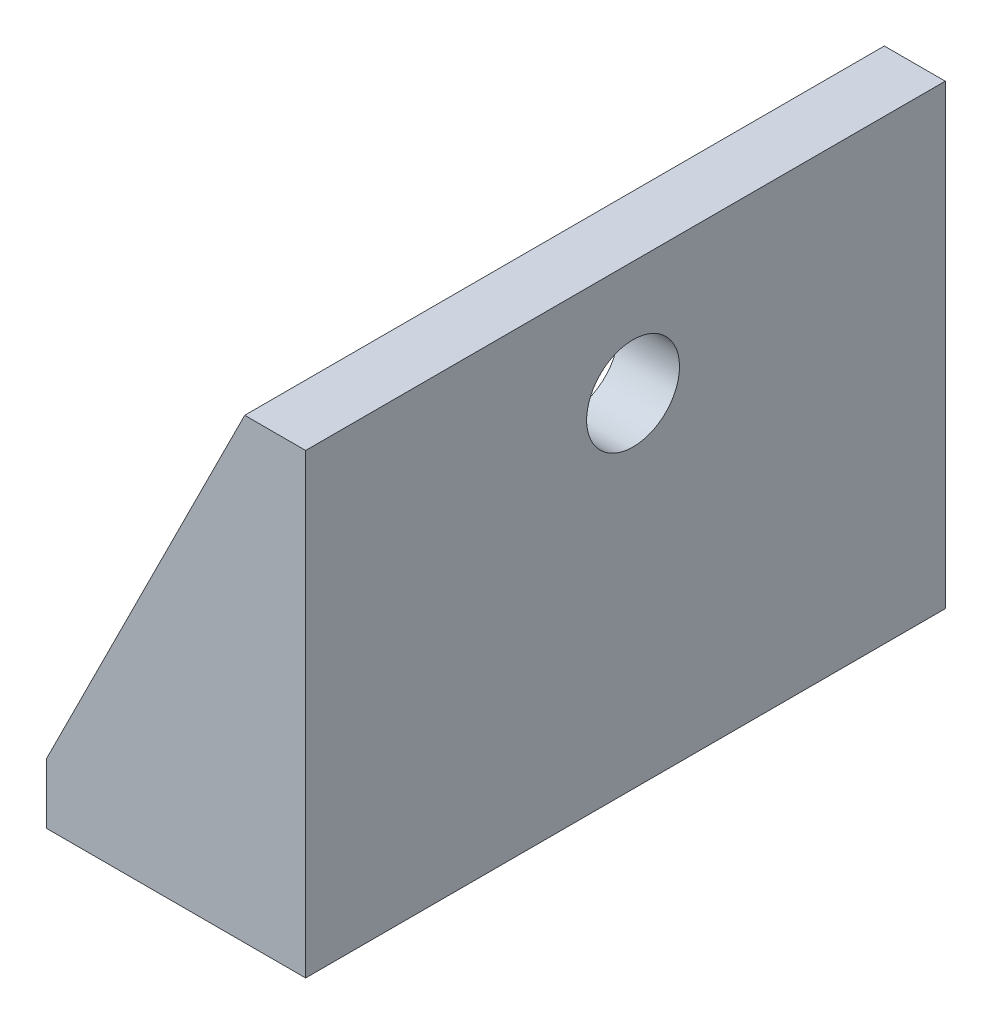
ISO-10303-21;
HEADER;
FILE_DESCRIPTION(('STEP AP214'),'2;1');
FILE_NAME('part.step','',(''),(''),'','','');
FILE_SCHEMA(('AUTOMOTIVE_DESIGN { 1 0 10303 214 1 1 1 1 }'));
ENDSEC;
DATA;
#1=APPLICATION_CONTEXT('core data for automotive mechanical design processes');
#2=APPLICATION_PROTOCOL_DEFINITION('international standard','automotive_design',2000,#1);
#3=PRODUCT_CONTEXT('',#1,'mechanical');
#4=PRODUCT('Part','Part','',(#3));
#5=PRODUCT_RELATED_PRODUCT_CATEGORY('part','',(#4));
#6=PRODUCT_DEFINITION_FORMATION('','',#4);
#7=PRODUCT_DEFINITION_CONTEXT('part definition',#1,'design');
#8=PRODUCT_DEFINITION('design','',#6,#7);
#9=PRODUCT_DEFINITION_SHAPE('','',#8);
#10=(LENGTH_UNIT() NAMED_UNIT(*) SI_UNIT(.MILLI.,.METRE.));
#11=(NAMED_UNIT(*) PLANE_ANGLE_UNIT() SI_UNIT($,.RADIAN.));
#12=(NAMED_UNIT(*) SI_UNIT($,.STERADIAN.) SOLID_ANGLE_UNIT());
#13=UNCERTAINTY_MEASURE_WITH_UNIT(LENGTH_MEASURE(1.E-05),#10,'distance_accuracy_value','');
#14=(GEOMETRIC_REPRESENTATION_CONTEXT(3) GLOBAL_UNCERTAINTY_ASSIGNED_CONTEXT((#13)) GLOBAL_UNIT_ASSIGNED_CONTEXT((#10,
#11,#12)) REPRESENTATION_CONTEXT('',''));
#15=CARTESIAN_POINT('',(0.,0.,0.));
#16=DIRECTION('',(0.,0.,1.));
#17=DIRECTION('',(1.,0.,0.));
#18=AXIS2_PLACEMENT_3D('',#15,#16,#17);
#19=CARTESIAN_POINT('',(0.720000000000004,4.,-14.));
#20=DIRECTION('',(0.,-1.,0.));
#21=DIRECTION('',(0.,0.,-1.));
#22=AXIS2_PLACEMENT_3D('',#19,#20,#21);
#23=CYLINDRICAL_SURFACE('',#22,1.75);
#24=CARTESIAN_POINT('',(0.720000000000004,0.,-14.));
#25=DIRECTION('',(0.,1.,0.));
#26=DIRECTION('',(0.,0.,1.));
#27=AXIS2_PLACEMENT_3D('',#24,#25,#26);
#28=CIRCLE('',#27,1.75);
#29=CARTESIAN_POINT('',(0.720000000000004,0.,-12.25));
#30=VERTEX_POINT('',#29);
#31=EDGE_CURVE('E412',#30,#30,#28,.T.);
#32=ORIENTED_EDGE('',*,*,#31,.F.);
#33=EDGE_LOOP('',(#32));
#34=FACE_BOUND('',#33,.T.);
#35=CARTESIAN_POINT('',(0.720000000000004,1.5,-14.));
#36=DIRECTION('',(0.,1.,0.));
#37=DIRECTION('',(0.,0.,1.));
#38=AXIS2_PLACEMENT_3D('',#35,#36,#37);
#39=CIRCLE('',#38,1.75);
#40=CARTESIAN_POINT('',(0.720000000000004,1.5,-12.25));
#41=VERTEX_POINT('',#40);
#42=EDGE_CURVE('E49',#41,#41,#39,.T.);
#43=ORIENTED_EDGE('',*,*,#42,.T.);
#44=EDGE_LOOP('',(#43));
#45=FACE_BOUND('',#44,.T.);
#46=ADVANCED_FACE('F45',(#34,#45),#23,.F.);
#47=CARTESIAN_POINT('',(0.720000000000035,4.,14.));
#48=DIRECTION('',(0.,-1.,0.));
#49=DIRECTION('',(0.,0.,-1.));
#50=AXIS2_PLACEMENT_3D('',#47,#48,#49);
#51=CYLINDRICAL_SURFACE('',#50,1.75);
#52=CARTESIAN_POINT('',(0.720000000000035,0.,14.));
#53=DIRECTION('',(0.,1.,0.));
#54=DIRECTION('',(0.,0.,1.));
#55=AXIS2_PLACEMENT_3D('',#52,#53,#54);
#56=CIRCLE('',#55,1.75);
#57=CARTESIAN_POINT('',(0.720000000000035,0.,15.75));
#58=VERTEX_POINT('',#57);
#59=EDGE_CURVE('E399',#58,#58,#56,.T.);
#60=ORIENTED_EDGE('',*,*,#59,.F.);
#61=EDGE_LOOP('',(#60));
#62=FACE_BOUND('',#61,.T.);
#63=CARTESIAN_POINT('',(0.720000000000035,1.5,14.));
#64=DIRECTION('',(0.,1.,0.));
#65=DIRECTION('',(0.,0.,1.));
#66=AXIS2_PLACEMENT_3D('',#63,#64,#65);
#67=CIRCLE('',#66,1.75);
#68=CARTESIAN_POINT('',(0.720000000000035,1.5,15.75));
#69=VERTEX_POINT('',#68);
#70=EDGE_CURVE('E277',#69,#69,#67,.T.);
#71=ORIENTED_EDGE('',*,*,#70,.T.);
#72=EDGE_LOOP('',(#71));
#73=FACE_BOUND('',#72,.T.);
#74=ADVANCED_FACE('F47',(#62,#73),#51,.F.);
#75=CARTESIAN_POINT('',(0.,4.,0.));
#76=DIRECTION('',(0.,1.,0.));
#77=DIRECTION('',(0.,0.,1.));
#78=AXIS2_PLACEMENT_3D('',#75,#76,#77);
#79=PLANE('',#78);
#80=DIRECTION('',(-0.5,0.,0.866025403784439));
#81=VECTOR('',#80,1.);
#82=CARTESIAN_POINT('',(-0.9254482671904,4.,11.15));
#83=LINE('',#82,#81);
#84=CARTESIAN_POINT('',(-0.9254482671904,4.,11.15));
#85=VERTEX_POINT('',#84);
#86=CARTESIAN_POINT('',(-2.57089653438083,4.,14.));
#87=VERTEX_POINT('',#86);
#88=EDGE_CURVE('E63',#85,#87,#83,.T.);
#89=ORIENTED_EDGE('',*,*,#88,.F.);
#90=DIRECTION('',(-1.,0.,0.));
#91=VECTOR('',#90,1.);
#92=CARTESIAN_POINT('',(2.36544826719046,4.,11.15));
#93=LINE('',#92,#91);
#94=CARTESIAN_POINT('',(2.36544826719046,4.,11.15));
#95=VERTEX_POINT('',#94);
#96=EDGE_CURVE('E232',#95,#85,#93,.T.);
#97=ORIENTED_EDGE('',*,*,#96,.F.);
#98=DIRECTION('',(-0.5,0.,-0.866025403784439));
#99=VECTOR('',#98,1.);
#100=CARTESIAN_POINT('',(4.0108965343809,4.,14.));
#101=LINE('',#100,#99);
#102=CARTESIAN_POINT('',(4.0108965343809,4.,14.));
#103=VERTEX_POINT('',#102);
#104=EDGE_CURVE('E267',#103,#95,#101,.T.);
#105=ORIENTED_EDGE('',*,*,#104,.F.);
#106=DIRECTION('',(0.5,0.,-0.866025403784439));
#107=VECTOR('',#106,1.);
#108=CARTESIAN_POINT('',(2.36544826719047,4.,16.85));
#109=LINE('',#108,#107);
#110=CARTESIAN_POINT('',(2.36544826719047,4.,16.85));
#111=VERTEX_POINT('',#110);
#112=EDGE_CURVE('E263',#111,#103,#109,.T.);
#113=ORIENTED_EDGE('',*,*,#112,.F.);
#114=DIRECTION('',(1.,0.,0.));
#115=VECTOR('',#114,1.);
#116=CARTESIAN_POINT('',(-0.925448267190399,4.,16.85));
#117=LINE('',#116,#115);
#118=CARTESIAN_POINT('',(-0.925448267190399,4.,16.85));
#119=VERTEX_POINT('',#118);
#120=EDGE_CURVE('E259',#119,#111,#117,.T.);
#121=ORIENTED_EDGE('',*,*,#120,.F.);
#122=DIRECTION('',(0.5,0.,0.866025403784439));
#123=VECTOR('',#122,1.);
#124=CARTESIAN_POINT('',(-2.57089653438083,4.,14.));
#125=LINE('',#124,#123);
#126=EDGE_CURVE('E255',#87,#119,#125,.T.);
#127=ORIENTED_EDGE('',*,*,#126,.F.);
#128=EDGE_LOOP('',(#89,#97,#105,#113,#121,#127));
#129=FACE_BOUND('',#128,.T.);
#130=DIRECTION('',(-0.5,0.,0.866025403784439));
#131=VECTOR('',#130,1.);
#132=CARTESIAN_POINT('',(-0.92544826719043,4.,-16.85));
#133=LINE('',#132,#131);
#134=CARTESIAN_POINT('',(-0.92544826719043,4.,-16.85));
#135=VERTEX_POINT('',#134);
#136=CARTESIAN_POINT('',(-2.57089653438086,4.,-14.));
#137=VERTEX_POINT('',#136);
#138=EDGE_CURVE('E71',#135,#137,#133,.T.);
#139=ORIENTED_EDGE('',*,*,#138,.F.);
#140=DIRECTION('',(-1.,0.,0.));
#141=VECTOR('',#140,1.);
#142=CARTESIAN_POINT('',(2.36544826719043,4.,-16.85));
#143=LINE('',#142,#141);
#144=CARTESIAN_POINT('',(2.36544826719043,4.,-16.85));
#145=VERTEX_POINT('',#144);
#146=EDGE_CURVE('E310',#145,#135,#143,.T.);
#147=ORIENTED_EDGE('',*,*,#146,.F.);
#148=DIRECTION('',(-0.5,0.,-0.866025403784439));
#149=VECTOR('',#148,1.);
#150=CARTESIAN_POINT('',(4.01089653438087,4.,-14.));
#151=LINE('',#150,#149);
#152=CARTESIAN_POINT('',(4.01089653438087,4.,-14.));
#153=VERTEX_POINT('',#152);
#154=EDGE_CURVE('E314',#153,#145,#151,.T.);
#155=ORIENTED_EDGE('',*,*,#154,.F.);
#156=DIRECTION('',(0.5,0.,-0.866025403784439));
#157=VECTOR('',#156,1.);
#158=CARTESIAN_POINT('',(2.36544826719044,4.,-11.15));
#159=LINE('',#158,#157);
#160=CARTESIAN_POINT('',(2.36544826719044,4.,-11.15));
#161=VERTEX_POINT('',#160);
#162=EDGE_CURVE('E319',#161,#153,#159,.T.);
#163=ORIENTED_EDGE('',*,*,#162,.F.);
#164=DIRECTION('',(1.,0.,0.));
#165=VECTOR('',#164,1.);
#166=CARTESIAN_POINT('',(-0.925448267190429,4.,-11.15));
#167=LINE('',#166,#165);
#168=CARTESIAN_POINT('',(-0.925448267190429,4.,-11.15));
#169=VERTEX_POINT('',#168);
#170=EDGE_CURVE('E323',#169,#161,#167,.T.);
#171=ORIENTED_EDGE('',*,*,#170,.F.);
#172=DIRECTION('',(0.5,0.,0.866025403784439));
#173=VECTOR('',#172,1.);
#174=CARTESIAN_POINT('',(-2.57089653438086,4.,-14.));
#175=LINE('',#174,#173);
#176=EDGE_CURVE('E327',#137,#169,#175,.T.);
#177=ORIENTED_EDGE('',*,*,#176,.F.);
#178=EDGE_LOOP('',(#139,#147,#155,#163,#171,#177));
#179=FACE_BOUND('',#178,.T.);
#180=DIRECTION('',(0.,0.,-1.));
#181=VECTOR('',#180,1.);
#182=CARTESIAN_POINT('',(5.5,4.,0.));
#183=LINE('',#182,#181);
#184=CARTESIAN_POINT('',(5.5,4.,19.));
#185=VERTEX_POINT('',#184);
#186=CARTESIAN_POINT('',(5.5,4.,-19.));
#187=VERTEX_POINT('',#186);
#188=EDGE_CURVE('E405',#185,#187,#183,.T.);
#189=ORIENTED_EDGE('',*,*,#188,.T.);
#190=DIRECTION('',(-1.,0.,0.));
#191=VECTOR('',#190,1.);
#192=CARTESIAN_POINT('',(0.,4.,-19.));
#193=LINE('',#192,#191);
#194=CARTESIAN_POINT('',(-7.5,4.,-19.));
#195=VERTEX_POINT('',#194);
#196=EDGE_CURVE('E366',#187,#195,#193,.T.);
#197=ORIENTED_EDGE('',*,*,#196,.T.);
#198=DIRECTION('',(0.,0.,1.));
#199=VECTOR('',#198,1.);
#200=CARTESIAN_POINT('',(-7.5,4.,0.));
#201=LINE('',#200,#199);
#202=CARTESIAN_POINT('',(-7.5,4.,19.));
#203=VERTEX_POINT('',#202);
#204=EDGE_CURVE('E195',#195,#203,#201,.T.);
#205=ORIENTED_EDGE('',*,*,#204,.T.);
#206=DIRECTION('',(1.,0.,0.));
#207=VECTOR('',#206,1.);
#208=CARTESIAN_POINT('',(0.,4.,19.));
#209=LINE('',#208,#207);
#210=EDGE_CURVE('E381',#203,#185,#209,.T.);
#211=ORIENTED_EDGE('',*,*,#210,.T.);
#212=EDGE_LOOP('',(#189,#197,#205,#211));
#213=FACE_BOUND('',#212,.T.);
#214=ADVANCED_FACE('F457',(#129,#179,#213),#79,.T.);
#215=CARTESIAN_POINT('',(5.5,30.,0.));
#216=DIRECTION('',(-1.,0.,0.));
#217=DIRECTION('',(0.,0.,1.));
#218=AXIS2_PLACEMENT_3D('',#215,#216,#217);
#219=PLANE('',#218);
#220=CARTESIAN_POINT('',(5.50000000000001,22.5,-0.500000000000001));
#221=DIRECTION('',(-1.,0.,0.));
#222=DIRECTION('',(0.,0.,1.));
#223=AXIS2_PLACEMENT_3D('',#220,#221,#222);
#224=CIRCLE('',#223,3.05);
#225=CARTESIAN_POINT('',(5.50000000000001,22.5,2.55));
#226=VERTEX_POINT('',#225);
#227=EDGE_CURVE('E214',#226,#226,#224,.T.);
#228=ORIENTED_EDGE('',*,*,#227,.F.);
#229=EDGE_LOOP('',(#228));
#230=FACE_BOUND('',#229,.T.);
#231=DIRECTION('',(0.,0.,-1.));
#232=VECTOR('',#231,1.);
#233=CARTESIAN_POINT('',(5.5,30.,0.));
#234=LINE('',#233,#232);
#235=CARTESIAN_POINT('',(5.50000000000001,30.,19.));
#236=VERTEX_POINT('',#235);
#237=CARTESIAN_POINT('',(5.5,30.,-19.));
#238=VERTEX_POINT('',#237);
#239=EDGE_CURVE('E400',#236,#238,#234,.T.);
#240=ORIENTED_EDGE('',*,*,#239,.T.);
#241=DIRECTION('',(0.,-1.,0.));
#242=VECTOR('',#241,1.);
#243=CARTESIAN_POINT('',(5.5,30.,-19.));
#244=LINE('',#243,#242);
#245=EDGE_CURVE('E359',#238,#187,#244,.T.);
#246=ORIENTED_EDGE('',*,*,#245,.T.);
#247=ORIENTED_EDGE('',*,*,#188,.F.);
#248=DIRECTION('',(0.,1.,0.));
#249=VECTOR('',#248,1.);
#250=CARTESIAN_POINT('',(5.5,30.,19.));
#251=LINE('',#250,#249);
#252=EDGE_CURVE('E374',#185,#236,#251,.T.);
#253=ORIENTED_EDGE('',*,*,#252,.T.);
#254=EDGE_LOOP('',(#240,#246,#247,#253));
#255=FACE_BOUND('',#254,.T.);
#256=ADVANCED_FACE('F460',(#230,#255),#219,.T.);
#257=CARTESIAN_POINT('',(0.,4.,-21.));
#258=DIRECTION('',(0.,0.,1.));
#259=DIRECTION('',(1.,0.,0.));
#260=AXIS2_PLACEMENT_3D('',#257,#258,#259);
#261=PLANE('',#260);
#262=DIRECTION('',(0.447213595499958,0.894427190999916,0.));
#263=VECTOR('',#262,1.);
#264=CARTESIAN_POINT('',(-7.5,4.,-21.));
#265=LINE('',#264,#263);
#266=CARTESIAN_POINT('',(-7.5,4.,-21.));
#267=VERTEX_POINT('',#266);
#268=CARTESIAN_POINT('',(5.50000000000001,30.,-21.));
#269=VERTEX_POINT('',#268);
#270=EDGE_CURVE('E355',#267,#269,#265,.T.);
#271=ORIENTED_EDGE('',*,*,#270,.T.);
#272=DIRECTION('',(-1.,0.,0.));
#273=VECTOR('',#272,1.);
#274=CARTESIAN_POINT('',(0.,30.,-21.));
#275=LINE('',#274,#273);
#276=CARTESIAN_POINT('',(9.5,30.,-21.));
#277=VERTEX_POINT('',#276);
#278=EDGE_CURVE('E391',#277,#269,#275,.T.);
#279=ORIENTED_EDGE('',*,*,#278,.F.);
#280=DIRECTION('',(0.,1.,0.));
#281=VECTOR('',#280,1.);
#282=CARTESIAN_POINT('',(9.5,0.,-21.));
#283=LINE('',#282,#281);
#284=CARTESIAN_POINT('',(9.5,0.,-21.));
#285=VERTEX_POINT('',#284);
#286=EDGE_CURVE('E207',#285,#277,#283,.T.);
#287=ORIENTED_EDGE('',*,*,#286,.F.);
#288=DIRECTION('',(-1.,0.,0.));
#289=VECTOR('',#288,1.);
#290=CARTESIAN_POINT('',(0.,0.,-21.));
#291=LINE('',#290,#289);
#292=CARTESIAN_POINT('',(-7.5,0.,-21.));
#293=VERTEX_POINT('',#292);
#294=EDGE_CURVE('E202',#285,#293,#291,.T.);
#295=ORIENTED_EDGE('',*,*,#294,.T.);
#296=DIRECTION('',(0.,-1.,0.));
#297=VECTOR('',#296,1.);
#298=CARTESIAN_POINT('',(-7.5,4.,-21.));
#299=LINE('',#298,#297);
#300=EDGE_CURVE('E11',#267,#293,#299,.T.);
#301=ORIENTED_EDGE('',*,*,#300,.F.);
#302=EDGE_LOOP('',(#271,#279,#287,#295,#301));
#303=FACE_BOUND('',#302,.T.);
#304=ADVANCED_FACE('F482',(#303),#261,.F.);
#305=CARTESIAN_POINT('',(-7.5,4.,0.));
#306=DIRECTION('',(1.,0.,0.));
#307=DIRECTION('',(0.,0.,-1.));
#308=AXIS2_PLACEMENT_3D('',#305,#306,#307);
#309=PLANE('',#308);
#310=DIRECTION('',(0.,0.,1.));
#311=VECTOR('',#310,1.);
#312=CARTESIAN_POINT('',(-7.5,0.,0.));
#313=LINE('',#312,#311);
#314=CARTESIAN_POINT('',(-7.5,0.,21.));
#315=VERTEX_POINT('',#314);
#316=EDGE_CURVE('E196',#293,#315,#313,.T.);
#317=ORIENTED_EDGE('',*,*,#316,.T.);
#318=DIRECTION('',(0.,-1.,0.));
#319=VECTOR('',#318,1.);
#320=CARTESIAN_POINT('',(-7.5,4.,21.));
#321=LINE('',#320,#319);
#322=CARTESIAN_POINT('',(-7.5,4.,21.));
#323=VERTEX_POINT('',#322);
#324=EDGE_CURVE('E55',#323,#315,#321,.T.);
#325=ORIENTED_EDGE('',*,*,#324,.F.);
#326=DIRECTION('',(0.,0.,-1.));
#327=VECTOR('',#326,1.);
#328=CARTESIAN_POINT('',(-7.5,4.,0.));
#329=LINE('',#328,#327);
#330=EDGE_CURVE('E384',#203,#323,#329,.F.);
#331=ORIENTED_EDGE('',*,*,#330,.F.);
#332=ORIENTED_EDGE('',*,*,#204,.F.);
#333=EDGE_CURVE('E401',#267,#195,#201,.T.);
#334=ORIENTED_EDGE('',*,*,#333,.F.);
#335=ORIENTED_EDGE('',*,*,#300,.T.);
#336=EDGE_LOOP('',(#317,#325,#331,#332,#334,#335));
#337=FACE_BOUND('',#336,.T.);
#338=ADVANCED_FACE('F479',(#337),#309,.F.);
#339=CARTESIAN_POINT('',(0.,4.,21.));
#340=DIRECTION('',(0.,0.,1.));
#341=DIRECTION('',(1.,0.,0.));
#342=AXIS2_PLACEMENT_3D('',#339,#340,#341);
#343=PLANE('',#342);
#344=ORIENTED_EDGE('',*,*,#324,.T.);
#345=DIRECTION('',(-1.,0.,0.));
#346=VECTOR('',#345,1.);
#347=CARTESIAN_POINT('',(0.,0.,21.));
#348=LINE('',#347,#346);
#349=CARTESIAN_POINT('',(9.50000000000001,0.,21.));
#350=VERTEX_POINT('',#349);
#351=EDGE_CURVE('E185',#350,#315,#348,.T.);
#352=ORIENTED_EDGE('',*,*,#351,.F.);
#353=DIRECTION('',(0.,-1.,0.));
#354=VECTOR('',#353,1.);
#355=CARTESIAN_POINT('',(9.50000000000001,0.,21.));
#356=LINE('',#355,#354);
#357=CARTESIAN_POINT('',(9.50000000000001,30.,21.));
#358=VERTEX_POINT('',#357);
#359=EDGE_CURVE('E189',#358,#350,#356,.T.);
#360=ORIENTED_EDGE('',*,*,#359,.F.);
#361=DIRECTION('',(-1.,0.,0.));
#362=VECTOR('',#361,1.);
#363=CARTESIAN_POINT('',(0.,30.,21.));
#364=LINE('',#363,#362);
#365=CARTESIAN_POINT('',(5.5,30.,21.));
#366=VERTEX_POINT('',#365);
#367=EDGE_CURVE('E388',#358,#366,#364,.T.);
#368=ORIENTED_EDGE('',*,*,#367,.T.);
#369=DIRECTION('',(0.447213595499958,0.894427190999916,0.));
#370=VECTOR('',#369,1.);
#371=CARTESIAN_POINT('',(-7.5,4.,21.));
#372=LINE('',#371,#370);
#373=EDGE_CURVE('E370',#323,#366,#372,.T.);
#374=ORIENTED_EDGE('',*,*,#373,.F.);
#375=EDGE_LOOP('',(#344,#352,#360,#368,#374));
#376=FACE_BOUND('',#375,.T.);
#377=ADVANCED_FACE('F187',(#376),#343,.T.);
#378=CARTESIAN_POINT('',(0.,0.,0.));
#379=DIRECTION('',(0.,1.,0.));
#380=DIRECTION('',(0.,0.,1.));
#381=AXIS2_PLACEMENT_3D('',#378,#379,#380);
#382=PLANE('',#381);
#383=ORIENTED_EDGE('',*,*,#316,.F.);
#384=ORIENTED_EDGE('',*,*,#294,.F.);
#385=DIRECTION('',(0.,0.,-1.));
#386=VECTOR('',#385,1.);
#387=CARTESIAN_POINT('',(9.50000000000001,0.,21.));
#388=LINE('',#387,#386);
#389=EDGE_CURVE('E199',#350,#285,#388,.T.);
#390=ORIENTED_EDGE('',*,*,#389,.F.);
#391=ORIENTED_EDGE('',*,*,#351,.T.);
#392=EDGE_LOOP('',(#383,#384,#390,#391));
#393=FACE_BOUND('',#392,.T.);
#394=ORIENTED_EDGE('',*,*,#59,.T.);
#395=EDGE_LOOP('',(#394));
#396=FACE_BOUND('',#395,.T.);
#397=ORIENTED_EDGE('',*,*,#31,.T.);
#398=EDGE_LOOP('',(#397));
#399=FACE_BOUND('',#398,.T.);
#400=ADVANCED_FACE('F200',(#393,#396,#399),#382,.F.);
#401=CARTESIAN_POINT('',(0.,30.,0.));
#402=DIRECTION('',(0.,1.,0.));
#403=DIRECTION('',(0.,0.,1.));
#404=AXIS2_PLACEMENT_3D('',#401,#402,#403);
#405=PLANE('',#404);
#406=EDGE_CURVE('E394',#238,#269,#234,.T.);
#407=ORIENTED_EDGE('',*,*,#406,.F.);
#408=ORIENTED_EDGE('',*,*,#239,.F.);
#409=EDGE_CURVE('E395',#366,#236,#234,.T.);
#410=ORIENTED_EDGE('',*,*,#409,.F.);
#411=ORIENTED_EDGE('',*,*,#367,.F.);
#412=DIRECTION('',(0.,0.,1.));
#413=VECTOR('',#412,1.);
#414=CARTESIAN_POINT('',(9.50000000000001,30.,21.));
#415=LINE('',#414,#413);
#416=EDGE_CURVE('E212',#277,#358,#415,.T.);
#417=ORIENTED_EDGE('',*,*,#416,.F.);
#418=ORIENTED_EDGE('',*,*,#278,.T.);
#419=EDGE_LOOP('',(#407,#408,#410,#411,#417,#418));
#420=FACE_BOUND('',#419,.T.);
#421=ADVANCED_FACE('F488',(#420),#405,.T.);
#422=CARTESIAN_POINT('',(-7.5,4.,21.));
#423=DIRECTION('',(0.894427190999916,-0.447213595499958,0.));
#424=DIRECTION('',(0.447213595499958,0.894427190999916,0.));
#425=AXIS2_PLACEMENT_3D('',#422,#423,#424);
#426=PLANE('',#425);
#427=DIRECTION('',(0.447213595499958,0.894427190999916,0.));
#428=VECTOR('',#427,1.);
#429=CARTESIAN_POINT('',(-7.5,4.,19.));
#430=LINE('',#429,#428);
#431=EDGE_CURVE('E369',#203,#236,#430,.T.);
#432=ORIENTED_EDGE('',*,*,#431,.F.);
#433=ORIENTED_EDGE('',*,*,#330,.T.);
#434=ORIENTED_EDGE('',*,*,#373,.T.);
#435=ORIENTED_EDGE('',*,*,#409,.T.);
#436=EDGE_LOOP('',(#432,#433,#434,#435));
#437=FACE_BOUND('',#436,.T.);
#438=ADVANCED_FACE('F485',(#437),#426,.F.);
#439=CARTESIAN_POINT('',(0.,15.,19.));
#440=DIRECTION('',(0.,0.,1.));
#441=DIRECTION('',(1.,0.,0.));
#442=AXIS2_PLACEMENT_3D('',#439,#440,#441);
#443=PLANE('',#442);
#444=ORIENTED_EDGE('',*,*,#210,.F.);
#445=ORIENTED_EDGE('',*,*,#431,.T.);
#446=ORIENTED_EDGE('',*,*,#252,.F.);
#447=EDGE_LOOP('',(#444,#445,#446));
#448=FACE_BOUND('',#447,.T.);
#449=ADVANCED_FACE('F491',(#448),#443,.F.);
#450=CARTESIAN_POINT('',(-7.5,4.,-21.));
#451=DIRECTION('',(-0.894427190999916,0.447213595499958,0.));
#452=DIRECTION('',(0.447213595499958,0.894427190999916,0.));
#453=AXIS2_PLACEMENT_3D('',#450,#451,#452);
#454=PLANE('',#453);
#455=ORIENTED_EDGE('',*,*,#270,.F.);
#456=ORIENTED_EDGE('',*,*,#333,.T.);
#457=DIRECTION('',(0.447213595499958,0.894427190999916,0.));
#458=VECTOR('',#457,1.);
#459=CARTESIAN_POINT('',(-7.5,4.,-19.));
#460=LINE('',#459,#458);
#461=EDGE_CURVE('E360',#195,#238,#460,.T.);
#462=ORIENTED_EDGE('',*,*,#461,.T.);
#463=ORIENTED_EDGE('',*,*,#406,.T.);
#464=EDGE_LOOP('',(#455,#456,#462,#463));
#465=FACE_BOUND('',#464,.T.);
#466=ADVANCED_FACE('F476',(#465),#454,.T.);
#467=CARTESIAN_POINT('',(0.,15.,-19.));
#468=DIRECTION('',(0.,0.,-1.));
#469=DIRECTION('',(-1.,0.,0.));
#470=AXIS2_PLACEMENT_3D('',#467,#468,#469);
#471=PLANE('',#470);
#472=ORIENTED_EDGE('',*,*,#196,.F.);
#473=ORIENTED_EDGE('',*,*,#245,.F.);
#474=ORIENTED_EDGE('',*,*,#461,.F.);
#475=EDGE_LOOP('',(#472,#473,#474));
#476=FACE_BOUND('',#475,.T.);
#477=ADVANCED_FACE('F472',(#476),#471,.F.);
#478=CARTESIAN_POINT('',(-0.9254482671904,1.5,11.15));
#479=DIRECTION('',(-0.866025403784439,0.,-0.5));
#480=DIRECTION('',(-0.5,0.,0.866025403784439));
#481=AXIS2_PLACEMENT_3D('',#478,#479,#480);
#482=PLANE('',#481);
#483=ORIENTED_EDGE('',*,*,#88,.T.);
#484=DIRECTION('',(0.,1.,0.));
#485=VECTOR('',#484,1.);
#486=CARTESIAN_POINT('',(-2.57089653438083,1.5,14.));
#487=LINE('',#486,#485);
#488=CARTESIAN_POINT('',(-2.57089653438083,1.5,14.));
#489=VERTEX_POINT('',#488);
#490=EDGE_CURVE('E252',#489,#87,#487,.T.);
#491=ORIENTED_EDGE('',*,*,#490,.F.);
#492=DIRECTION('',(-0.5,0.,0.866025403784439));
#493=VECTOR('',#492,1.);
#494=CARTESIAN_POINT('',(-0.9254482671904,1.5,11.15));
#495=LINE('',#494,#493);
#496=CARTESIAN_POINT('',(-0.9254482671904,1.5,11.15));
#497=VERTEX_POINT('',#496);
#498=EDGE_CURVE('E227',#497,#489,#495,.T.);
#499=ORIENTED_EDGE('',*,*,#498,.F.);
#500=DIRECTION('',(0.,1.,0.));
#501=VECTOR('',#500,1.);
#502=CARTESIAN_POINT('',(-0.9254482671904,1.5,11.15));
#503=LINE('',#502,#501);
#504=EDGE_CURVE('E274',#497,#85,#503,.T.);
#505=ORIENTED_EDGE('',*,*,#504,.T.);
#506=EDGE_LOOP('',(#483,#491,#499,#505));
#507=FACE_BOUND('',#506,.T.);
#508=ADVANCED_FACE('F531',(#507),#482,.F.);
#509=CARTESIAN_POINT('',(2.36544826719046,1.5,11.15));
#510=DIRECTION('',(0.,0.,-1.));
#511=DIRECTION('',(-1.,0.,0.));
#512=AXIS2_PLACEMENT_3D('',#509,#510,#511);
#513=PLANE('',#512);
#514=ORIENTED_EDGE('',*,*,#96,.T.);
#515=ORIENTED_EDGE('',*,*,#504,.F.);
#516=DIRECTION('',(-1.,0.,0.));
#517=VECTOR('',#516,1.);
#518=CARTESIAN_POINT('',(2.36544826719046,1.5,11.15));
#519=LINE('',#518,#517);
#520=CARTESIAN_POINT('',(2.36544826719046,1.5,11.15));
#521=VERTEX_POINT('',#520);
#522=EDGE_CURVE('E248',#521,#497,#519,.T.);
#523=ORIENTED_EDGE('',*,*,#522,.F.);
#524=DIRECTION('',(0.,1.,0.));
#525=VECTOR('',#524,1.);
#526=CARTESIAN_POINT('',(2.36544826719046,1.5,11.15));
#527=LINE('',#526,#525);
#528=EDGE_CURVE('E278',#521,#95,#527,.T.);
#529=ORIENTED_EDGE('',*,*,#528,.T.);
#530=EDGE_LOOP('',(#514,#515,#523,#529));
#531=FACE_BOUND('',#530,.T.);
#532=ADVANCED_FACE('F548',(#531),#513,.F.);
#533=CARTESIAN_POINT('',(4.0108965343809,1.5,14.));
#534=DIRECTION('',(0.866025403784439,0.,-0.5));
#535=DIRECTION('',(-0.5,0.,-0.866025403784439));
#536=AXIS2_PLACEMENT_3D('',#533,#534,#535);
#537=PLANE('',#536);
#538=ORIENTED_EDGE('',*,*,#104,.T.);
#539=ORIENTED_EDGE('',*,*,#528,.F.);
#540=DIRECTION('',(-0.5,0.,-0.866025403784439));
#541=VECTOR('',#540,1.);
#542=CARTESIAN_POINT('',(4.0108965343809,1.5,14.));
#543=LINE('',#542,#541);
#544=CARTESIAN_POINT('',(4.0108965343809,1.5,14.));
#545=VERTEX_POINT('',#544);
#546=EDGE_CURVE('E244',#545,#521,#543,.T.);
#547=ORIENTED_EDGE('',*,*,#546,.F.);
#548=DIRECTION('',(0.,1.,0.));
#549=VECTOR('',#548,1.);
#550=CARTESIAN_POINT('',(4.0108965343809,1.5,14.));
#551=LINE('',#550,#549);
#552=EDGE_CURVE('E281',#545,#103,#551,.T.);
#553=ORIENTED_EDGE('',*,*,#552,.T.);
#554=EDGE_LOOP('',(#538,#539,#547,#553));
#555=FACE_BOUND('',#554,.T.);
#556=ADVANCED_FACE('F560',(#555),#537,.F.);
#557=CARTESIAN_POINT('',(2.36544826719047,1.5,16.85));
#558=DIRECTION('',(0.866025403784439,0.,0.5));
#559=DIRECTION('',(0.5,0.,-0.866025403784439));
#560=AXIS2_PLACEMENT_3D('',#557,#558,#559);
#561=PLANE('',#560);
#562=ORIENTED_EDGE('',*,*,#112,.T.);
#563=ORIENTED_EDGE('',*,*,#552,.F.);
#564=DIRECTION('',(0.5,0.,-0.866025403784439));
#565=VECTOR('',#564,1.);
#566=CARTESIAN_POINT('',(2.36544826719047,1.5,16.85));
#567=LINE('',#566,#565);
#568=CARTESIAN_POINT('',(2.36544826719047,1.5,16.85));
#569=VERTEX_POINT('',#568);
#570=EDGE_CURVE('E240',#569,#545,#567,.T.);
#571=ORIENTED_EDGE('',*,*,#570,.F.);
#572=DIRECTION('',(0.,1.,0.));
#573=VECTOR('',#572,1.);
#574=CARTESIAN_POINT('',(2.36544826719047,1.5,16.85));
#575=LINE('',#574,#573);
#576=EDGE_CURVE('E284',#569,#111,#575,.T.);
#577=ORIENTED_EDGE('',*,*,#576,.T.);
#578=EDGE_LOOP('',(#562,#563,#571,#577));
#579=FACE_BOUND('',#578,.T.);
#580=ADVANCED_FACE('F556',(#579),#561,.F.);
#581=CARTESIAN_POINT('',(-0.925448267190399,1.5,16.85));
#582=DIRECTION('',(0.,0.,1.));
#583=DIRECTION('',(1.,0.,0.));
#584=AXIS2_PLACEMENT_3D('',#581,#582,#583);
#585=PLANE('',#584);
#586=ORIENTED_EDGE('',*,*,#120,.T.);
#587=ORIENTED_EDGE('',*,*,#576,.F.);
#588=DIRECTION('',(1.,0.,0.));
#589=VECTOR('',#588,1.);
#590=CARTESIAN_POINT('',(-0.925448267190399,1.5,16.85));
#591=LINE('',#590,#589);
#592=CARTESIAN_POINT('',(-0.925448267190399,1.5,16.85));
#593=VERTEX_POINT('',#592);
#594=EDGE_CURVE('E236',#593,#569,#591,.T.);
#595=ORIENTED_EDGE('',*,*,#594,.F.);
#596=DIRECTION('',(0.,1.,0.));
#597=VECTOR('',#596,1.);
#598=CARTESIAN_POINT('',(-0.925448267190399,1.5,16.85));
#599=LINE('',#598,#597);
#600=EDGE_CURVE('E287',#593,#119,#599,.T.);
#601=ORIENTED_EDGE('',*,*,#600,.T.);
#602=EDGE_LOOP('',(#586,#587,#595,#601));
#603=FACE_BOUND('',#602,.T.);
#604=ADVANCED_FACE('F552',(#603),#585,.F.);
#605=CARTESIAN_POINT('',(-2.57089653438083,1.5,14.));
#606=DIRECTION('',(-0.866025403784438,0.,0.5));
#607=DIRECTION('',(0.5,0.,0.866025403784439));
#608=AXIS2_PLACEMENT_3D('',#605,#606,#607);
#609=PLANE('',#608);
#610=ORIENTED_EDGE('',*,*,#126,.T.);
#611=ORIENTED_EDGE('',*,*,#600,.F.);
#612=DIRECTION('',(0.5,0.,0.866025403784439));
#613=VECTOR('',#612,1.);
#614=CARTESIAN_POINT('',(-2.57089653438083,1.5,14.));
#615=LINE('',#614,#613);
#616=EDGE_CURVE('E231',#489,#593,#615,.T.);
#617=ORIENTED_EDGE('',*,*,#616,.F.);
#618=ORIENTED_EDGE('',*,*,#490,.T.);
#619=EDGE_LOOP('',(#610,#611,#617,#618));
#620=FACE_BOUND('',#619,.T.);
#621=ADVANCED_FACE('F549',(#620),#609,.F.);
#622=CARTESIAN_POINT('',(0.,1.5,0.));
#623=DIRECTION('',(0.,1.,0.));
#624=DIRECTION('',(0.,0.,1.));
#625=AXIS2_PLACEMENT_3D('',#622,#623,#624);
#626=PLANE('',#625);
#627=ORIENTED_EDGE('',*,*,#70,.F.);
#628=EDGE_LOOP('',(#627));
#629=FACE_BOUND('',#628,.T.);
#630=ORIENTED_EDGE('',*,*,#498,.T.);
#631=ORIENTED_EDGE('',*,*,#616,.T.);
#632=ORIENTED_EDGE('',*,*,#594,.T.);
#633=ORIENTED_EDGE('',*,*,#570,.T.);
#634=ORIENTED_EDGE('',*,*,#546,.T.);
#635=ORIENTED_EDGE('',*,*,#522,.T.);
#636=EDGE_LOOP('',(#630,#631,#632,#633,#634,#635));
#637=FACE_BOUND('',#636,.T.);
#638=ADVANCED_FACE('F545',(#629,#637),#626,.T.);
#639=CARTESIAN_POINT('',(-0.92544826719043,1.5,-16.85));
#640=DIRECTION('',(-0.866025403784439,0.,-0.5));
#641=DIRECTION('',(-0.5,0.,0.866025403784439));
#642=AXIS2_PLACEMENT_3D('',#639,#640,#641);
#643=PLANE('',#642);
#644=ORIENTED_EDGE('',*,*,#138,.T.);
#645=DIRECTION('',(0.,1.,0.));
#646=VECTOR('',#645,1.);
#647=CARTESIAN_POINT('',(-2.57089653438086,1.5,-14.));
#648=LINE('',#647,#646);
#649=CARTESIAN_POINT('',(-2.57089653438086,1.5,-14.));
#650=VERTEX_POINT('',#649);
#651=EDGE_CURVE('E292',#650,#137,#648,.T.);
#652=ORIENTED_EDGE('',*,*,#651,.F.);
#653=DIRECTION('',(-0.5,0.,0.866025403784439));
#654=VECTOR('',#653,1.);
#655=CARTESIAN_POINT('',(-0.92544826719043,1.5,-16.85));
#656=LINE('',#655,#654);
#657=CARTESIAN_POINT('',(-0.92544826719043,1.5,-16.85));
#658=VERTEX_POINT('',#657);
#659=EDGE_CURVE('E315',#658,#650,#656,.T.);
#660=ORIENTED_EDGE('',*,*,#659,.F.);
#661=DIRECTION('',(0.,1.,0.));
#662=VECTOR('',#661,1.);
#663=CARTESIAN_POINT('',(-0.92544826719043,1.5,-16.85));
#664=LINE('',#663,#662);
#665=EDGE_CURVE('E226',#658,#135,#664,.T.);
#666=ORIENTED_EDGE('',*,*,#665,.T.);
#667=EDGE_LOOP('',(#644,#652,#660,#666));
#668=FACE_BOUND('',#667,.T.);
#669=ADVANCED_FACE('F438',(#668),#643,.F.);
#670=CARTESIAN_POINT('',(2.36544826719043,1.5,-16.85));
#671=DIRECTION('',(0.,0.,-1.));
#672=DIRECTION('',(-1.,0.,0.));
#673=AXIS2_PLACEMENT_3D('',#670,#671,#672);
#674=PLANE('',#673);
#675=ORIENTED_EDGE('',*,*,#146,.T.);
#676=ORIENTED_EDGE('',*,*,#665,.F.);
#677=DIRECTION('',(-1.,0.,0.));
#678=VECTOR('',#677,1.);
#679=CARTESIAN_POINT('',(2.36544826719043,1.5,-16.85));
#680=LINE('',#679,#678);
#681=CARTESIAN_POINT('',(2.36544826719043,1.5,-16.85));
#682=VERTEX_POINT('',#681);
#683=EDGE_CURVE('E295',#682,#658,#680,.T.);
#684=ORIENTED_EDGE('',*,*,#683,.F.);
#685=DIRECTION('',(0.,1.,0.));
#686=VECTOR('',#685,1.);
#687=CARTESIAN_POINT('',(2.36544826719043,1.5,-16.85));
#688=LINE('',#687,#686);
#689=EDGE_CURVE('E305',#682,#145,#688,.T.);
#690=ORIENTED_EDGE('',*,*,#689,.T.);
#691=EDGE_LOOP('',(#675,#676,#684,#690));
#692=FACE_BOUND('',#691,.T.);
#693=ADVANCED_FACE('F455',(#692),#674,.F.);
#694=CARTESIAN_POINT('',(4.01089653438087,1.5,-14.));
#695=DIRECTION('',(0.866025403784439,0.,-0.5));
#696=DIRECTION('',(-0.5,0.,-0.866025403784439));
#697=AXIS2_PLACEMENT_3D('',#694,#695,#696);
#698=PLANE('',#697);
#699=ORIENTED_EDGE('',*,*,#154,.T.);
#700=ORIENTED_EDGE('',*,*,#689,.F.);
#701=DIRECTION('',(-0.5,0.,-0.866025403784439));
#702=VECTOR('',#701,1.);
#703=CARTESIAN_POINT('',(4.01089653438087,1.5,-14.));
#704=LINE('',#703,#702);
#705=CARTESIAN_POINT('',(4.01089653438087,1.5,-14.));
#706=VERTEX_POINT('',#705);
#707=EDGE_CURVE('E336',#706,#682,#704,.T.);
#708=ORIENTED_EDGE('',*,*,#707,.F.);
#709=DIRECTION('',(0.,1.,0.));
#710=VECTOR('',#709,1.);
#711=CARTESIAN_POINT('',(4.01089653438087,1.5,-14.));
#712=LINE('',#711,#710);
#713=EDGE_CURVE('E302',#706,#153,#712,.T.);
#714=ORIENTED_EDGE('',*,*,#713,.T.);
#715=EDGE_LOOP('',(#699,#700,#708,#714));
#716=FACE_BOUND('',#715,.T.);
#717=ADVANCED_FACE('F452',(#716),#698,.F.);
#718=CARTESIAN_POINT('',(2.36544826719044,1.5,-11.15));
#719=DIRECTION('',(0.866025403784439,0.,0.5));
#720=DIRECTION('',(0.5,0.,-0.866025403784439));
#721=AXIS2_PLACEMENT_3D('',#718,#719,#720);
#722=PLANE('',#721);
#723=ORIENTED_EDGE('',*,*,#162,.T.);
#724=ORIENTED_EDGE('',*,*,#713,.F.);
#725=DIRECTION('',(0.5,0.,-0.866025403784439));
#726=VECTOR('',#725,1.);
#727=CARTESIAN_POINT('',(2.36544826719044,1.5,-11.15));
#728=LINE('',#727,#726);
#729=CARTESIAN_POINT('',(2.36544826719044,1.5,-11.15));
#730=VERTEX_POINT('',#729);
#731=EDGE_CURVE('E340',#730,#706,#728,.T.);
#732=ORIENTED_EDGE('',*,*,#731,.F.);
#733=DIRECTION('',(0.,1.,0.));
#734=VECTOR('',#733,1.);
#735=CARTESIAN_POINT('',(2.36544826719044,1.5,-11.15));
#736=LINE('',#735,#734);
#737=EDGE_CURVE('E299',#730,#161,#736,.T.);
#738=ORIENTED_EDGE('',*,*,#737,.T.);
#739=EDGE_LOOP('',(#723,#724,#732,#738));
#740=FACE_BOUND('',#739,.T.);
#741=ADVANCED_FACE('F448',(#740),#722,.F.);
#742=CARTESIAN_POINT('',(-0.925448267190429,1.5,-11.15));
#743=DIRECTION('',(0.,0.,1.));
#744=DIRECTION('',(1.,0.,0.));
#745=AXIS2_PLACEMENT_3D('',#742,#743,#744);
#746=PLANE('',#745);
#747=ORIENTED_EDGE('',*,*,#170,.T.);
#748=ORIENTED_EDGE('',*,*,#737,.F.);
#749=DIRECTION('',(1.,0.,0.));
#750=VECTOR('',#749,1.);
#751=CARTESIAN_POINT('',(-0.925448267190429,1.5,-11.15));
#752=LINE('',#751,#750);
#753=CARTESIAN_POINT('',(-0.925448267190429,1.5,-11.15));
#754=VERTEX_POINT('',#753);
#755=EDGE_CURVE('E344',#754,#730,#752,.T.);
#756=ORIENTED_EDGE('',*,*,#755,.F.);
#757=DIRECTION('',(0.,1.,0.));
#758=VECTOR('',#757,1.);
#759=CARTESIAN_POINT('',(-0.925448267190429,1.5,-11.15));
#760=LINE('',#759,#758);
#761=EDGE_CURVE('E296',#754,#169,#760,.T.);
#762=ORIENTED_EDGE('',*,*,#761,.T.);
#763=EDGE_LOOP('',(#747,#748,#756,#762));
#764=FACE_BOUND('',#763,.T.);
#765=ADVANCED_FACE('F444',(#764),#746,.F.);
#766=CARTESIAN_POINT('',(-2.57089653438086,1.5,-14.));
#767=DIRECTION('',(-0.866025403784439,0.,0.5));
#768=DIRECTION('',(0.5,0.,0.866025403784439));
#769=AXIS2_PLACEMENT_3D('',#766,#767,#768);
#770=PLANE('',#769);
#771=ORIENTED_EDGE('',*,*,#176,.T.);
#772=ORIENTED_EDGE('',*,*,#761,.F.);
#773=DIRECTION('',(0.5,0.,0.866025403784439));
#774=VECTOR('',#773,1.);
#775=CARTESIAN_POINT('',(-2.57089653438086,1.5,-14.));
#776=LINE('',#775,#774);
#777=EDGE_CURVE('E348',#650,#754,#776,.T.);
#778=ORIENTED_EDGE('',*,*,#777,.F.);
#779=ORIENTED_EDGE('',*,*,#651,.T.);
#780=EDGE_LOOP('',(#771,#772,#778,#779));
#781=FACE_BOUND('',#780,.T.);
#782=ADVANCED_FACE('F433',(#781),#770,.F.);
#783=CARTESIAN_POINT('',(0.,1.5,0.));
#784=DIRECTION('',(0.,1.,0.));
#785=DIRECTION('',(0.,0.,1.));
#786=AXIS2_PLACEMENT_3D('',#783,#784,#785);
#787=PLANE('',#786);
#788=ORIENTED_EDGE('',*,*,#42,.F.);
#789=EDGE_LOOP('',(#788));
#790=FACE_BOUND('',#789,.T.);
#791=ORIENTED_EDGE('',*,*,#659,.T.);
#792=ORIENTED_EDGE('',*,*,#777,.T.);
#793=ORIENTED_EDGE('',*,*,#755,.T.);
#794=ORIENTED_EDGE('',*,*,#731,.T.);
#795=ORIENTED_EDGE('',*,*,#707,.T.);
#796=ORIENTED_EDGE('',*,*,#683,.T.);
#797=EDGE_LOOP('',(#791,#792,#793,#794,#795,#796));
#798=FACE_BOUND('',#797,.T.);
#799=ADVANCED_FACE('F430',(#790,#798),#787,.T.);
#800=CARTESIAN_POINT('',(9.5,0.,0.));
#801=DIRECTION('',(-1.,0.,0.));
#802=DIRECTION('',(0.,0.,1.));
#803=AXIS2_PLACEMENT_3D('',#800,#801,#802);
#804=PLANE('',#803);
#805=CARTESIAN_POINT('',(9.5,22.5,-0.500000000000002));
#806=DIRECTION('',(1.,0.,0.));
#807=DIRECTION('',(0.,0.,-1.));
#808=AXIS2_PLACEMENT_3D('',#805,#806,#807);
#809=CIRCLE('',#808,3.05);
#810=CARTESIAN_POINT('',(9.5,22.5,-3.55));
#811=VERTEX_POINT('',#810);
#812=EDGE_CURVE('E218',#811,#811,#809,.T.);
#813=ORIENTED_EDGE('',*,*,#812,.F.);
#814=EDGE_LOOP('',(#813));
#815=FACE_BOUND('',#814,.T.);
#816=ORIENTED_EDGE('',*,*,#359,.T.);
#817=ORIENTED_EDGE('',*,*,#389,.T.);
#818=ORIENTED_EDGE('',*,*,#286,.T.);
#819=ORIENTED_EDGE('',*,*,#416,.T.);
#820=EDGE_LOOP('',(#816,#817,#818,#819));
#821=FACE_BOUND('',#820,.T.);
#822=ADVANCED_FACE('F210',(#815,#821),#804,.F.);
#823=CARTESIAN_POINT('',(-2.5,22.5,-0.5));
#824=DIRECTION('',(1.,0.,0.));
#825=DIRECTION('',(0.,0.,-1.));
#826=AXIS2_PLACEMENT_3D('',#823,#824,#825);
#827=CYLINDRICAL_SURFACE('',#826,3.05);
#828=ORIENTED_EDGE('',*,*,#227,.T.);
#829=EDGE_LOOP('',(#828));
#830=FACE_BOUND('',#829,.T.);
#831=ORIENTED_EDGE('',*,*,#812,.T.);
#832=EDGE_LOOP('',(#831));
#833=FACE_BOUND('',#832,.T.);
#834=ADVANCED_FACE('F572',(#830,#833),#827,.F.);
#835=CLOSED_SHELL('',(#46,#74,#214,#256,#304,#338,#377,#400,#421,#438,#449,#466,#477,#508,#532,
#556,#580,#604,#621,#638,#669,#693,#717,#741,#765,#782,#799,#822,#834));
#836=MANIFOLD_SOLID_BREP('B2',#835);
#837=ADVANCED_BREP_SHAPE_REPRESENTATION('',(#18,#836),#14);
#838=SHAPE_DEFINITION_REPRESENTATION(#9,#837);
ENDSEC;
END-ISO-10303-21;
